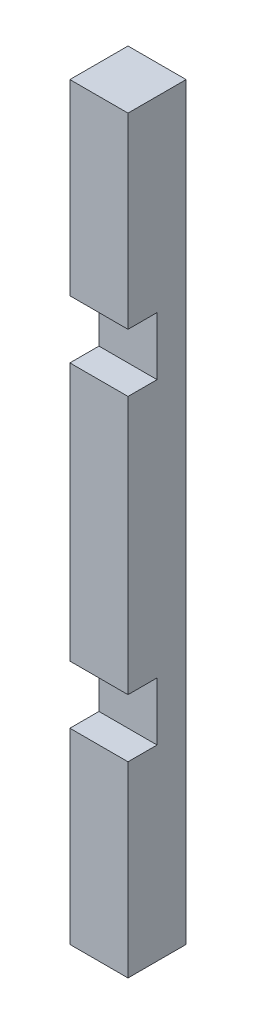
ISO-10303-21;
HEADER;
FILE_DESCRIPTION(('STEP AP214'),'2;1');
FILE_NAME('part.step','',(''),(''),'','','');
FILE_SCHEMA(('AUTOMOTIVE_DESIGN { 1 0 10303 214 1 1 1 1 }'));
ENDSEC;
DATA;
#1=APPLICATION_CONTEXT('core data for automotive mechanical design processes');
#2=APPLICATION_PROTOCOL_DEFINITION('international standard','automotive_design',2000,#1);
#3=PRODUCT_CONTEXT('',#1,'mechanical');
#4=PRODUCT('Part','Part','',(#3));
#5=PRODUCT_RELATED_PRODUCT_CATEGORY('part','',(#4));
#6=PRODUCT_DEFINITION_FORMATION('','',#4);
#7=PRODUCT_DEFINITION_CONTEXT('part definition',#1,'design');
#8=PRODUCT_DEFINITION('design','',#6,#7);
#9=PRODUCT_DEFINITION_SHAPE('','',#8);
#10=(LENGTH_UNIT() NAMED_UNIT(*) SI_UNIT(.MILLI.,.METRE.));
#11=(NAMED_UNIT(*) PLANE_ANGLE_UNIT() SI_UNIT($,.RADIAN.));
#12=(NAMED_UNIT(*) SI_UNIT($,.STERADIAN.) SOLID_ANGLE_UNIT());
#13=UNCERTAINTY_MEASURE_WITH_UNIT(LENGTH_MEASURE(1.E-05),#10,'distance_accuracy_value','');
#14=(GEOMETRIC_REPRESENTATION_CONTEXT(3) GLOBAL_UNCERTAINTY_ASSIGNED_CONTEXT((#13)) GLOBAL_UNIT_ASSIGNED_CONTEXT((#10,
#11,#12)) REPRESENTATION_CONTEXT('',''));
#15=CARTESIAN_POINT('',(0.,0.,0.));
#16=DIRECTION('',(0.,0.,1.));
#17=DIRECTION('',(1.,0.,0.));
#18=AXIS2_PLACEMENT_3D('',#15,#16,#17);
#19=CARTESIAN_POINT('',(0.,1160.,0.));
#20=DIRECTION('',(0.,0.,-1.));
#21=DIRECTION('',(-1.,0.,0.));
#22=AXIS2_PLACEMENT_3D('',#19,#20,#21);
#23=PLANE('',#22);
#24=DIRECTION('',(0.,-1.,0.));
#25=VECTOR('',#24,1.);
#26=CARTESIAN_POINT('',(90.,1160.,0.));
#27=LINE('',#26,#25);
#28=CARTESIAN_POINT('',(90.,290.,0.));
#29=VERTEX_POINT('',#28);
#30=CARTESIAN_POINT('',(90.,0.,0.));
#31=VERTEX_POINT('',#30);
#32=EDGE_CURVE('E197',#29,#31,#27,.T.);
#33=ORIENTED_EDGE('',*,*,#32,.F.);
#34=DIRECTION('',(1.,0.,0.));
#35=VECTOR('',#34,1.);
#36=CARTESIAN_POINT('',(90.,290.,0.));
#37=LINE('',#36,#35);
#38=CARTESIAN_POINT('',(0.,290.,0.));
#39=VERTEX_POINT('',#38);
#40=EDGE_CURVE('E138',#39,#29,#37,.T.);
#41=ORIENTED_EDGE('',*,*,#40,.F.);
#42=DIRECTION('',(0.,-1.,0.));
#43=VECTOR('',#42,1.);
#44=CARTESIAN_POINT('',(0.,1160.,0.));
#45=LINE('',#44,#43);
#46=CARTESIAN_POINT('',(0.,0.,0.));
#47=VERTEX_POINT('',#46);
#48=EDGE_CURVE('E42',#39,#47,#45,.T.);
#49=ORIENTED_EDGE('',*,*,#48,.T.);
#50=DIRECTION('',(1.,0.,0.));
#51=VECTOR('',#50,1.);
#52=CARTESIAN_POINT('',(0.,0.,0.));
#53=LINE('',#52,#51);
#54=EDGE_CURVE('E187',#47,#31,#53,.T.);
#55=ORIENTED_EDGE('',*,*,#54,.T.);
#56=EDGE_LOOP('',(#33,#41,#49,#55));
#57=FACE_BOUND('',#56,.T.);
#58=ADVANCED_FACE('F33',(#57),#23,.F.);
#59=CARTESIAN_POINT('',(0.,1160.,0.));
#60=VERTEX_POINT('',#59);
#61=CARTESIAN_POINT('',(0.,870.,0.));
#62=VERTEX_POINT('',#61);
#63=EDGE_CURVE('E11',#60,#62,#45,.T.);
#64=ORIENTED_EDGE('',*,*,#63,.T.);
#65=DIRECTION('',(-1.,0.,0.));
#66=VECTOR('',#65,1.);
#67=CARTESIAN_POINT('',(0.,870.,0.));
#68=LINE('',#67,#66);
#69=CARTESIAN_POINT('',(90.,870.,0.));
#70=VERTEX_POINT('',#69);
#71=EDGE_CURVE('E153',#70,#62,#68,.T.);
#72=ORIENTED_EDGE('',*,*,#71,.F.);
#73=CARTESIAN_POINT('',(90.,1160.,0.));
#74=VERTEX_POINT('',#73);
#75=EDGE_CURVE('E198',#74,#70,#27,.T.);
#76=ORIENTED_EDGE('',*,*,#75,.F.);
#77=DIRECTION('',(1.,0.,0.));
#78=VECTOR('',#77,1.);
#79=CARTESIAN_POINT('',(0.,1160.,0.));
#80=LINE('',#79,#78);
#81=EDGE_CURVE('E177',#60,#74,#80,.T.);
#82=ORIENTED_EDGE('',*,*,#81,.F.);
#83=EDGE_LOOP('',(#64,#72,#76,#82));
#84=FACE_BOUND('',#83,.T.);
#85=ADVANCED_FACE('F225',(#84),#23,.F.);
#86=CARTESIAN_POINT('',(0.,1160.,0.));
#87=DIRECTION('',(1.,0.,0.));
#88=DIRECTION('',(0.,0.,-1.));
#89=AXIS2_PLACEMENT_3D('',#86,#87,#88);
#90=PLANE('',#89);
#91=ORIENTED_EDGE('',*,*,#48,.F.);
#92=DIRECTION('',(0.,0.,1.));
#93=VECTOR('',#92,1.);
#94=CARTESIAN_POINT('',(0.,290.,-45.));
#95=LINE('',#94,#93);
#96=CARTESIAN_POINT('',(0.,290.,-45.));
#97=VERTEX_POINT('',#96);
#98=EDGE_CURVE('E146',#97,#39,#95,.T.);
#99=ORIENTED_EDGE('',*,*,#98,.F.);
#100=DIRECTION('',(0.,-1.,0.));
#101=VECTOR('',#100,1.);
#102=CARTESIAN_POINT('',(0.,290.,-45.));
#103=LINE('',#102,#101);
#104=CARTESIAN_POINT('',(0.,380.,-45.));
#105=VERTEX_POINT('',#104);
#106=EDGE_CURVE('E131',#105,#97,#103,.T.);
#107=ORIENTED_EDGE('',*,*,#106,.F.);
#108=DIRECTION('',(0.,0.,1.));
#109=VECTOR('',#108,1.);
#110=CARTESIAN_POINT('',(0.,380.,-45.));
#111=LINE('',#110,#109);
#112=CARTESIAN_POINT('',(0.,380.,0.));
#113=VERTEX_POINT('',#112);
#114=EDGE_CURVE('E129',#105,#113,#111,.T.);
#115=ORIENTED_EDGE('',*,*,#114,.T.);
#116=CARTESIAN_POINT('',(0.,780.,0.));
#117=VERTEX_POINT('',#116);
#118=EDGE_CURVE('E41',#117,#113,#45,.T.);
#119=ORIENTED_EDGE('',*,*,#118,.F.);
#120=DIRECTION('',(0.,0.,1.));
#121=VECTOR('',#120,1.);
#122=CARTESIAN_POINT('',(0.,780.,-45.));
#123=LINE('',#122,#121);
#124=CARTESIAN_POINT('',(0.,780.,-45.));
#125=VERTEX_POINT('',#124);
#126=EDGE_CURVE('E160',#125,#117,#123,.T.);
#127=ORIENTED_EDGE('',*,*,#126,.F.);
#128=DIRECTION('',(0.,-1.,0.));
#129=VECTOR('',#128,1.);
#130=CARTESIAN_POINT('',(0.,870.,-45.));
#131=LINE('',#130,#129);
#132=CARTESIAN_POINT('',(0.,870.,-45.));
#133=VERTEX_POINT('',#132);
#134=EDGE_CURVE('E151',#133,#125,#131,.T.);
#135=ORIENTED_EDGE('',*,*,#134,.F.);
#136=DIRECTION('',(0.,0.,1.));
#137=VECTOR('',#136,1.);
#138=CARTESIAN_POINT('',(0.,870.,-45.));
#139=LINE('',#138,#137);
#140=EDGE_CURVE('E165',#133,#62,#139,.T.);
#141=ORIENTED_EDGE('',*,*,#140,.T.);
#142=ORIENTED_EDGE('',*,*,#63,.F.);
#143=DIRECTION('',(0.,0.,1.));
#144=VECTOR('',#143,1.);
#145=CARTESIAN_POINT('',(0.,1160.,0.));
#146=LINE('',#145,#144);
#147=CARTESIAN_POINT('',(0.,1160.,-90.));
#148=VERTEX_POINT('',#147);
#149=EDGE_CURVE('E174',#148,#60,#146,.T.);
#150=ORIENTED_EDGE('',*,*,#149,.F.);
#151=DIRECTION('',(0.,-1.,0.));
#152=VECTOR('',#151,1.);
#153=CARTESIAN_POINT('',(0.,1160.,-90.));
#154=LINE('',#153,#152);
#155=CARTESIAN_POINT('',(0.,0.,-90.));
#156=VERTEX_POINT('',#155);
#157=EDGE_CURVE('E184',#148,#156,#154,.T.);
#158=ORIENTED_EDGE('',*,*,#157,.T.);
#159=DIRECTION('',(0.,0.,1.));
#160=VECTOR('',#159,1.);
#161=CARTESIAN_POINT('',(0.,0.,0.));
#162=LINE('',#161,#160);
#163=EDGE_CURVE('E168',#156,#47,#162,.T.);
#164=ORIENTED_EDGE('',*,*,#163,.T.);
#165=EDGE_LOOP('',(#91,#99,#107,#115,#119,#127,#135,#141,#142,#150,#158,#164));
#166=FACE_BOUND('',#165,.T.);
#167=ADVANCED_FACE('F35',(#166),#90,.F.);
#168=ORIENTED_EDGE('',*,*,#118,.T.);
#169=DIRECTION('',(-1.,0.,0.));
#170=VECTOR('',#169,1.);
#171=CARTESIAN_POINT('',(90.,380.,0.));
#172=LINE('',#171,#170);
#173=CARTESIAN_POINT('',(90.,380.,0.));
#174=VERTEX_POINT('',#173);
#175=EDGE_CURVE('E239',#174,#113,#172,.T.);
#176=ORIENTED_EDGE('',*,*,#175,.F.);
#177=CARTESIAN_POINT('',(90.,780.,0.));
#178=VERTEX_POINT('',#177);
#179=EDGE_CURVE('E144',#178,#174,#27,.T.);
#180=ORIENTED_EDGE('',*,*,#179,.F.);
#181=DIRECTION('',(1.,0.,0.));
#182=VECTOR('',#181,1.);
#183=CARTESIAN_POINT('',(0.,780.,0.));
#184=LINE('',#183,#182);
#185=EDGE_CURVE('E161',#117,#178,#184,.T.);
#186=ORIENTED_EDGE('',*,*,#185,.F.);
#187=EDGE_LOOP('',(#168,#176,#180,#186));
#188=FACE_BOUND('',#187,.T.);
#189=ADVANCED_FACE('F238',(#188),#23,.F.);
#190=CARTESIAN_POINT('',(90.,1160.,0.));
#191=DIRECTION('',(-1.,0.,0.));
#192=DIRECTION('',(0.,0.,1.));
#193=AXIS2_PLACEMENT_3D('',#190,#191,#192);
#194=PLANE('',#193);
#195=DIRECTION('',(0.,1.,0.));
#196=VECTOR('',#195,1.);
#197=CARTESIAN_POINT('',(90.,290.,-45.));
#198=LINE('',#197,#196);
#199=CARTESIAN_POINT('',(90.,290.,-45.));
#200=VERTEX_POINT('',#199);
#201=CARTESIAN_POINT('',(90.,380.,-45.));
#202=VERTEX_POINT('',#201);
#203=EDGE_CURVE('E132',#200,#202,#198,.T.);
#204=ORIENTED_EDGE('',*,*,#203,.F.);
#205=DIRECTION('',(0.,0.,1.));
#206=VECTOR('',#205,1.);
#207=CARTESIAN_POINT('',(90.,290.,-45.));
#208=LINE('',#207,#206);
#209=EDGE_CURVE('E163',#200,#29,#208,.T.);
#210=ORIENTED_EDGE('',*,*,#209,.T.);
#211=ORIENTED_EDGE('',*,*,#32,.T.);
#212=DIRECTION('',(0.,0.,-1.));
#213=VECTOR('',#212,1.);
#214=CARTESIAN_POINT('',(90.,0.,0.));
#215=LINE('',#214,#213);
#216=CARTESIAN_POINT('',(90.,0.,-90.));
#217=VERTEX_POINT('',#216);
#218=EDGE_CURVE('E190',#31,#217,#215,.T.);
#219=ORIENTED_EDGE('',*,*,#218,.T.);
#220=DIRECTION('',(0.,-1.,0.));
#221=VECTOR('',#220,1.);
#222=CARTESIAN_POINT('',(90.,1160.,-90.));
#223=LINE('',#222,#221);
#224=CARTESIAN_POINT('',(90.,1160.,-90.));
#225=VERTEX_POINT('',#224);
#226=EDGE_CURVE('E195',#225,#217,#223,.T.);
#227=ORIENTED_EDGE('',*,*,#226,.F.);
#228=DIRECTION('',(0.,0.,-1.));
#229=VECTOR('',#228,1.);
#230=CARTESIAN_POINT('',(90.,1160.,0.));
#231=LINE('',#230,#229);
#232=EDGE_CURVE('E180',#74,#225,#231,.T.);
#233=ORIENTED_EDGE('',*,*,#232,.F.);
#234=ORIENTED_EDGE('',*,*,#75,.T.);
#235=DIRECTION('',(0.,0.,1.));
#236=VECTOR('',#235,1.);
#237=CARTESIAN_POINT('',(90.,870.,-45.));
#238=LINE('',#237,#236);
#239=CARTESIAN_POINT('',(90.,870.,-45.));
#240=VERTEX_POINT('',#239);
#241=EDGE_CURVE('E169',#240,#70,#238,.T.);
#242=ORIENTED_EDGE('',*,*,#241,.F.);
#243=DIRECTION('',(0.,1.,0.));
#244=VECTOR('',#243,1.);
#245=CARTESIAN_POINT('',(90.,870.,-45.));
#246=LINE('',#245,#244);
#247=CARTESIAN_POINT('',(90.,780.,-45.));
#248=VERTEX_POINT('',#247);
#249=EDGE_CURVE('E155',#248,#240,#246,.T.);
#250=ORIENTED_EDGE('',*,*,#249,.F.);
#251=DIRECTION('',(0.,0.,1.));
#252=VECTOR('',#251,1.);
#253=CARTESIAN_POINT('',(90.,780.,-45.));
#254=LINE('',#253,#252);
#255=EDGE_CURVE('E171',#248,#178,#254,.T.);
#256=ORIENTED_EDGE('',*,*,#255,.T.);
#257=ORIENTED_EDGE('',*,*,#179,.T.);
#258=DIRECTION('',(0.,0.,1.));
#259=VECTOR('',#258,1.);
#260=CARTESIAN_POINT('',(90.,380.,-45.));
#261=LINE('',#260,#259);
#262=EDGE_CURVE('E126',#202,#174,#261,.T.);
#263=ORIENTED_EDGE('',*,*,#262,.F.);
#264=EDGE_LOOP('',(#204,#210,#211,#219,#227,#233,#234,#242,#250,#256,#257,#263));
#265=FACE_BOUND('',#264,.T.);
#266=ADVANCED_FACE('F141',(#265),#194,.F.);
#267=CARTESIAN_POINT('',(0.,1160.,-90.));
#268=DIRECTION('',(0.,0.,1.));
#269=DIRECTION('',(1.,0.,0.));
#270=AXIS2_PLACEMENT_3D('',#267,#268,#269);
#271=PLANE('',#270);
#272=DIRECTION('',(-1.,0.,0.));
#273=VECTOR('',#272,1.);
#274=CARTESIAN_POINT('',(0.,0.,-90.));
#275=LINE('',#274,#273);
#276=EDGE_CURVE('E178',#217,#156,#275,.T.);
#277=ORIENTED_EDGE('',*,*,#276,.T.);
#278=ORIENTED_EDGE('',*,*,#157,.F.);
#279=DIRECTION('',(-1.,0.,0.));
#280=VECTOR('',#279,1.);
#281=CARTESIAN_POINT('',(0.,1160.,-90.));
#282=LINE('',#281,#280);
#283=EDGE_CURVE('E182',#225,#148,#282,.T.);
#284=ORIENTED_EDGE('',*,*,#283,.F.);
#285=ORIENTED_EDGE('',*,*,#226,.T.);
#286=EDGE_LOOP('',(#277,#278,#284,#285));
#287=FACE_BOUND('',#286,.T.);
#288=ADVANCED_FACE('F216',(#287),#271,.F.);
#289=CARTESIAN_POINT('',(0.,1160.,0.));
#290=DIRECTION('',(0.,-1.,0.));
#291=DIRECTION('',(0.,0.,-1.));
#292=AXIS2_PLACEMENT_3D('',#289,#290,#291);
#293=PLANE('',#292);
#294=ORIENTED_EDGE('',*,*,#149,.T.);
#295=ORIENTED_EDGE('',*,*,#81,.T.);
#296=ORIENTED_EDGE('',*,*,#232,.T.);
#297=ORIENTED_EDGE('',*,*,#283,.T.);
#298=EDGE_LOOP('',(#294,#295,#296,#297));
#299=FACE_BOUND('',#298,.T.);
#300=ADVANCED_FACE('F222',(#299),#293,.F.);
#301=CARTESIAN_POINT('',(0.,0.,0.));
#302=DIRECTION('',(0.,-1.,0.));
#303=DIRECTION('',(0.,0.,-1.));
#304=AXIS2_PLACEMENT_3D('',#301,#302,#303);
#305=PLANE('',#304);
#306=ORIENTED_EDGE('',*,*,#163,.F.);
#307=ORIENTED_EDGE('',*,*,#276,.F.);
#308=ORIENTED_EDGE('',*,*,#218,.F.);
#309=ORIENTED_EDGE('',*,*,#54,.F.);
#310=EDGE_LOOP('',(#306,#307,#308,#309));
#311=FACE_BOUND('',#310,.T.);
#312=ADVANCED_FACE('F213',(#311),#305,.T.);
#313=CARTESIAN_POINT('',(0.,870.,-45.));
#314=DIRECTION('',(0.,1.,0.));
#315=DIRECTION('',(0.,0.,1.));
#316=AXIS2_PLACEMENT_3D('',#313,#314,#315);
#317=PLANE('',#316);
#318=ORIENTED_EDGE('',*,*,#71,.T.);
#319=ORIENTED_EDGE('',*,*,#140,.F.);
#320=DIRECTION('',(-1.,0.,0.));
#321=VECTOR('',#320,1.);
#322=CARTESIAN_POINT('',(0.,870.,-45.));
#323=LINE('',#322,#321);
#324=EDGE_CURVE('E157',#240,#133,#323,.T.);
#325=ORIENTED_EDGE('',*,*,#324,.F.);
#326=ORIENTED_EDGE('',*,*,#241,.T.);
#327=EDGE_LOOP('',(#318,#319,#325,#326));
#328=FACE_BOUND('',#327,.T.);
#329=ADVANCED_FACE('F227',(#328),#317,.F.);
#330=CARTESIAN_POINT('',(0.,780.,-45.));
#331=DIRECTION('',(0.,-1.,0.));
#332=DIRECTION('',(0.,0.,-1.));
#333=AXIS2_PLACEMENT_3D('',#330,#331,#332);
#334=PLANE('',#333);
#335=ORIENTED_EDGE('',*,*,#185,.T.);
#336=ORIENTED_EDGE('',*,*,#255,.F.);
#337=DIRECTION('',(1.,0.,0.));
#338=VECTOR('',#337,1.);
#339=CARTESIAN_POINT('',(0.,780.,-45.));
#340=LINE('',#339,#338);
#341=EDGE_CURVE('E57',#125,#248,#340,.T.);
#342=ORIENTED_EDGE('',*,*,#341,.F.);
#343=ORIENTED_EDGE('',*,*,#126,.T.);
#344=EDGE_LOOP('',(#335,#336,#342,#343));
#345=FACE_BOUND('',#344,.T.);
#346=ADVANCED_FACE('F254',(#345),#334,.F.);
#347=CARTESIAN_POINT('',(0.,0.,-45.));
#348=DIRECTION('',(0.,0.,1.));
#349=DIRECTION('',(1.,0.,0.));
#350=AXIS2_PLACEMENT_3D('',#347,#348,#349);
#351=PLANE('',#350);
#352=ORIENTED_EDGE('',*,*,#134,.T.);
#353=ORIENTED_EDGE('',*,*,#341,.T.);
#354=ORIENTED_EDGE('',*,*,#249,.T.);
#355=ORIENTED_EDGE('',*,*,#324,.T.);
#356=EDGE_LOOP('',(#352,#353,#354,#355));
#357=FACE_BOUND('',#356,.T.);
#358=ADVANCED_FACE('F232',(#357),#351,.T.);
#359=CARTESIAN_POINT('',(90.,290.,-45.));
#360=DIRECTION('',(0.,-1.,0.));
#361=DIRECTION('',(1.,0.,0.));
#362=AXIS2_PLACEMENT_3D('',#359,#360,#361);
#363=PLANE('',#362);
#364=ORIENTED_EDGE('',*,*,#40,.T.);
#365=ORIENTED_EDGE('',*,*,#209,.F.);
#366=DIRECTION('',(1.,0.,0.));
#367=VECTOR('',#366,1.);
#368=CARTESIAN_POINT('',(90.,290.,-45.));
#369=LINE('',#368,#367);
#370=EDGE_CURVE('E49',#97,#200,#369,.T.);
#371=ORIENTED_EDGE('',*,*,#370,.F.);
#372=ORIENTED_EDGE('',*,*,#98,.T.);
#373=EDGE_LOOP('',(#364,#365,#371,#372));
#374=FACE_BOUND('',#373,.T.);
#375=ADVANCED_FACE('F246',(#374),#363,.F.);
#376=CARTESIAN_POINT('',(90.,380.,-45.));
#377=DIRECTION('',(0.,1.,0.));
#378=DIRECTION('',(0.,0.,1.));
#379=AXIS2_PLACEMENT_3D('',#376,#377,#378);
#380=PLANE('',#379);
#381=ORIENTED_EDGE('',*,*,#175,.T.);
#382=ORIENTED_EDGE('',*,*,#114,.F.);
#383=DIRECTION('',(-1.,0.,0.));
#384=VECTOR('',#383,1.);
#385=CARTESIAN_POINT('',(90.,380.,-45.));
#386=LINE('',#385,#384);
#387=EDGE_CURVE('E123',#202,#105,#386,.T.);
#388=ORIENTED_EDGE('',*,*,#387,.F.);
#389=ORIENTED_EDGE('',*,*,#262,.T.);
#390=EDGE_LOOP('',(#381,#382,#388,#389));
#391=FACE_BOUND('',#390,.T.);
#392=ADVANCED_FACE('F124',(#391),#380,.F.);
#393=CARTESIAN_POINT('',(0.,0.,-45.));
#394=DIRECTION('',(0.,0.,1.));
#395=DIRECTION('',(1.,0.,0.));
#396=AXIS2_PLACEMENT_3D('',#393,#394,#395);
#397=PLANE('',#396);
#398=ORIENTED_EDGE('',*,*,#203,.T.);
#399=ORIENTED_EDGE('',*,*,#387,.T.);
#400=ORIENTED_EDGE('',*,*,#106,.T.);
#401=ORIENTED_EDGE('',*,*,#370,.T.);
#402=EDGE_LOOP('',(#398,#399,#400,#401));
#403=FACE_BOUND('',#402,.T.);
#404=ADVANCED_FACE('F135',(#403),#397,.T.);
#405=CLOSED_SHELL('',(#58,#85,#167,#189,#266,#288,#300,#312,#329,#346,#358,#375,#392,#404));
#406=MANIFOLD_SOLID_BREP('B2',#405);
#407=ADVANCED_BREP_SHAPE_REPRESENTATION('',(#18,#406),#14);
#408=SHAPE_DEFINITION_REPRESENTATION(#9,#407);
ENDSEC;
END-ISO-10303-21;
